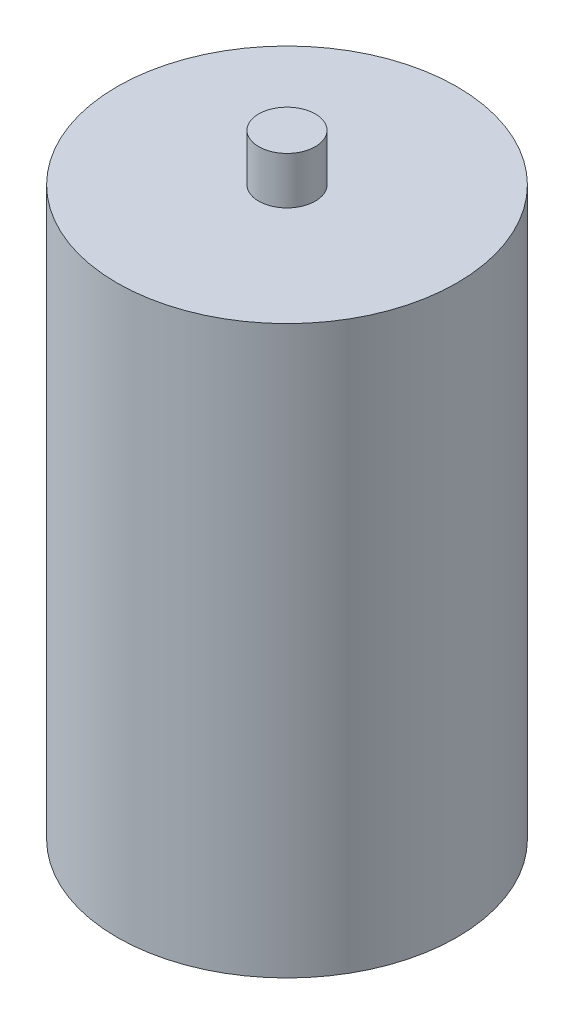
ISO-10303-21;
HEADER;
FILE_DESCRIPTION(('STEP AP214'),'2;1');
FILE_NAME('part.step','',(''),(''),'','','');
FILE_SCHEMA(('AUTOMOTIVE_DESIGN { 1 0 10303 214 1 1 1 1 }'));
ENDSEC;
DATA;
#1=APPLICATION_CONTEXT('core data for automotive mechanical design processes');
#2=APPLICATION_PROTOCOL_DEFINITION('international standard','automotive_design',2000,#1);
#3=PRODUCT_CONTEXT('',#1,'mechanical');
#4=PRODUCT('Part','Part','',(#3));
#5=PRODUCT_RELATED_PRODUCT_CATEGORY('part','',(#4));
#6=PRODUCT_DEFINITION_FORMATION('','',#4);
#7=PRODUCT_DEFINITION_CONTEXT('part definition',#1,'design');
#8=PRODUCT_DEFINITION('design','',#6,#7);
#9=PRODUCT_DEFINITION_SHAPE('','',#8);
#10=(LENGTH_UNIT() NAMED_UNIT(*) SI_UNIT(.MILLI.,.METRE.));
#11=(NAMED_UNIT(*) PLANE_ANGLE_UNIT() SI_UNIT($,.RADIAN.));
#12=(NAMED_UNIT(*) SI_UNIT($,.STERADIAN.) SOLID_ANGLE_UNIT());
#13=UNCERTAINTY_MEASURE_WITH_UNIT(LENGTH_MEASURE(1.E-05),#10,'distance_accuracy_value','');
#14=(GEOMETRIC_REPRESENTATION_CONTEXT(3) GLOBAL_UNCERTAINTY_ASSIGNED_CONTEXT((#13)) GLOBAL_UNIT_ASSIGNED_CONTEXT((#10,
#11,#12)) REPRESENTATION_CONTEXT('',''));
#15=CARTESIAN_POINT('',(0.,0.,0.));
#16=DIRECTION('',(0.,0.,1.));
#17=DIRECTION('',(1.,0.,0.));
#18=AXIS2_PLACEMENT_3D('',#15,#16,#17);
#19=CARTESIAN_POINT('',(0.,0.,0.));
#20=DIRECTION('',(0.,1.,0.));
#21=DIRECTION('',(-1.,0.,0.));
#22=AXIS2_PLACEMENT_3D('',#19,#20,#21);
#23=PLANE('',#22);
#24=CARTESIAN_POINT('',(0.,0.,0.));
#25=DIRECTION('',(0.,1.,0.));
#26=DIRECTION('',(-1.,0.,0.));
#27=AXIS2_PLACEMENT_3D('',#24,#25,#26);
#28=CIRCLE('',#27,3.);
#29=CARTESIAN_POINT('',(-3.,0.,0.));
#30=VERTEX_POINT('',#29);
#31=EDGE_CURVE('E10',#30,#30,#28,.T.);
#32=ORIENTED_EDGE('',*,*,#31,.F.);
#33=EDGE_LOOP('',(#32));
#34=FACE_BOUND('',#33,.T.);
#35=ADVANCED_FACE('F31',(#34),#23,.F.);
#36=CARTESIAN_POINT('',(0.,70.,0.));
#37=DIRECTION('',(0.,1.,0.));
#38=DIRECTION('',(-1.,0.,0.));
#39=AXIS2_PLACEMENT_3D('',#36,#37,#38);
#40=CYLINDRICAL_SURFACE('',#39,3.);
#41=CARTESIAN_POINT('',(0.,5.,0.));
#42=DIRECTION('',(0.,1.,0.));
#43=DIRECTION('',(-1.,0.,0.));
#44=AXIS2_PLACEMENT_3D('',#41,#42,#43);
#45=CIRCLE('',#44,3.);
#46=CARTESIAN_POINT('',(-3.,5.,0.));
#47=VERTEX_POINT('',#46);
#48=EDGE_CURVE('E37',#47,#47,#45,.T.);
#49=ORIENTED_EDGE('',*,*,#48,.F.);
#50=EDGE_LOOP('',(#49));
#51=FACE_BOUND('',#50,.T.);
#52=ORIENTED_EDGE('',*,*,#31,.T.);
#53=EDGE_LOOP('',(#52));
#54=FACE_BOUND('',#53,.T.);
#55=ADVANCED_FACE('F79',(#51,#54),#40,.T.);
#56=CARTESIAN_POINT('',(3.,5.,0.));
#57=DIRECTION('',(0.,1.,0.));
#58=DIRECTION('',(-1.,0.,0.));
#59=AXIS2_PLACEMENT_3D('',#56,#57,#58);
#60=PLANE('',#59);
#61=CARTESIAN_POINT('',(0.,5.,0.));
#62=DIRECTION('',(0.,1.,0.));
#63=DIRECTION('',(-1.,0.,0.));
#64=AXIS2_PLACEMENT_3D('',#61,#62,#63);
#65=CIRCLE('',#64,18.);
#66=CARTESIAN_POINT('',(-18.,5.,0.));
#67=VERTEX_POINT('',#66);
#68=EDGE_CURVE('E41',#67,#67,#65,.T.);
#69=ORIENTED_EDGE('',*,*,#68,.F.);
#70=EDGE_LOOP('',(#69));
#71=FACE_BOUND('',#70,.T.);
#72=ORIENTED_EDGE('',*,*,#48,.T.);
#73=EDGE_LOOP('',(#72));
#74=FACE_BOUND('',#73,.T.);
#75=ADVANCED_FACE('F74',(#71,#74),#60,.F.);
#76=CARTESIAN_POINT('',(0.,70.,0.));
#77=DIRECTION('',(0.,1.,0.));
#78=DIRECTION('',(-1.,0.,0.));
#79=AXIS2_PLACEMENT_3D('',#76,#77,#78);
#80=CYLINDRICAL_SURFACE('',#79,18.);
#81=CARTESIAN_POINT('',(0.,65.,0.));
#82=DIRECTION('',(0.,1.,0.));
#83=DIRECTION('',(-1.,0.,0.));
#84=AXIS2_PLACEMENT_3D('',#81,#82,#83);
#85=CIRCLE('',#84,18.);
#86=CARTESIAN_POINT('',(-18.,65.,0.));
#87=VERTEX_POINT('',#86);
#88=EDGE_CURVE('E45',#87,#87,#85,.T.);
#89=ORIENTED_EDGE('',*,*,#88,.F.);
#90=EDGE_LOOP('',(#89));
#91=FACE_BOUND('',#90,.T.);
#92=ORIENTED_EDGE('',*,*,#68,.T.);
#93=EDGE_LOOP('',(#92));
#94=FACE_BOUND('',#93,.T.);
#95=ADVANCED_FACE('F68',(#91,#94),#80,.T.);
#96=CARTESIAN_POINT('',(18.,65.,0.));
#97=DIRECTION('',(0.,-1.,0.));
#98=DIRECTION('',(1.,0.,0.));
#99=AXIS2_PLACEMENT_3D('',#96,#97,#98);
#100=PLANE('',#99);
#101=CARTESIAN_POINT('',(0.,65.,0.));
#102=DIRECTION('',(0.,1.,0.));
#103=DIRECTION('',(-1.,0.,0.));
#104=AXIS2_PLACEMENT_3D('',#101,#102,#103);
#105=CIRCLE('',#104,3.00000000000001);
#106=CARTESIAN_POINT('',(-3.00000000000001,65.,0.));
#107=VERTEX_POINT('',#106);
#108=EDGE_CURVE('E50',#107,#107,#105,.T.);
#109=ORIENTED_EDGE('',*,*,#108,.F.);
#110=EDGE_LOOP('',(#109));
#111=FACE_BOUND('',#110,.T.);
#112=ORIENTED_EDGE('',*,*,#88,.T.);
#113=EDGE_LOOP('',(#112));
#114=FACE_BOUND('',#113,.T.);
#115=ADVANCED_FACE('F62',(#111,#114),#100,.F.);
#116=CARTESIAN_POINT('',(0.,70.,0.));
#117=DIRECTION('',(0.,1.,0.));
#118=DIRECTION('',(-1.,0.,0.));
#119=AXIS2_PLACEMENT_3D('',#116,#117,#118);
#120=CYLINDRICAL_SURFACE('',#119,3.00000000000001);
#121=CARTESIAN_POINT('',(0.,70.,0.));
#122=DIRECTION('',(0.,1.,0.));
#123=DIRECTION('',(-1.,0.,0.));
#124=AXIS2_PLACEMENT_3D('',#121,#122,#123);
#125=CIRCLE('',#124,3.00000000000001);
#126=CARTESIAN_POINT('',(-3.00000000000001,70.,0.));
#127=VERTEX_POINT('',#126);
#128=EDGE_CURVE('E53',#127,#127,#125,.T.);
#129=ORIENTED_EDGE('',*,*,#128,.F.);
#130=EDGE_LOOP('',(#129));
#131=FACE_BOUND('',#130,.T.);
#132=ORIENTED_EDGE('',*,*,#108,.T.);
#133=EDGE_LOOP('',(#132));
#134=FACE_BOUND('',#133,.T.);
#135=ADVANCED_FACE('F59',(#131,#134),#120,.T.);
#136=CARTESIAN_POINT('',(3.00000000000001,70.,0.));
#137=DIRECTION('',(0.,-1.,0.));
#138=DIRECTION('',(1.,0.,0.));
#139=AXIS2_PLACEMENT_3D('',#136,#137,#138);
#140=PLANE('',#139);
#141=ORIENTED_EDGE('',*,*,#128,.T.);
#142=EDGE_LOOP('',(#141));
#143=FACE_BOUND('',#142,.T.);
#144=ADVANCED_FACE('F57',(#143),#140,.F.);
#145=CLOSED_SHELL('',(#35,#55,#75,#95,#115,#135,#144));
#146=MANIFOLD_SOLID_BREP('B2',#145);
#147=ADVANCED_BREP_SHAPE_REPRESENTATION('',(#18,#146),#14);
#148=SHAPE_DEFINITION_REPRESENTATION(#9,#147);
ENDSEC;
END-ISO-10303-21;
